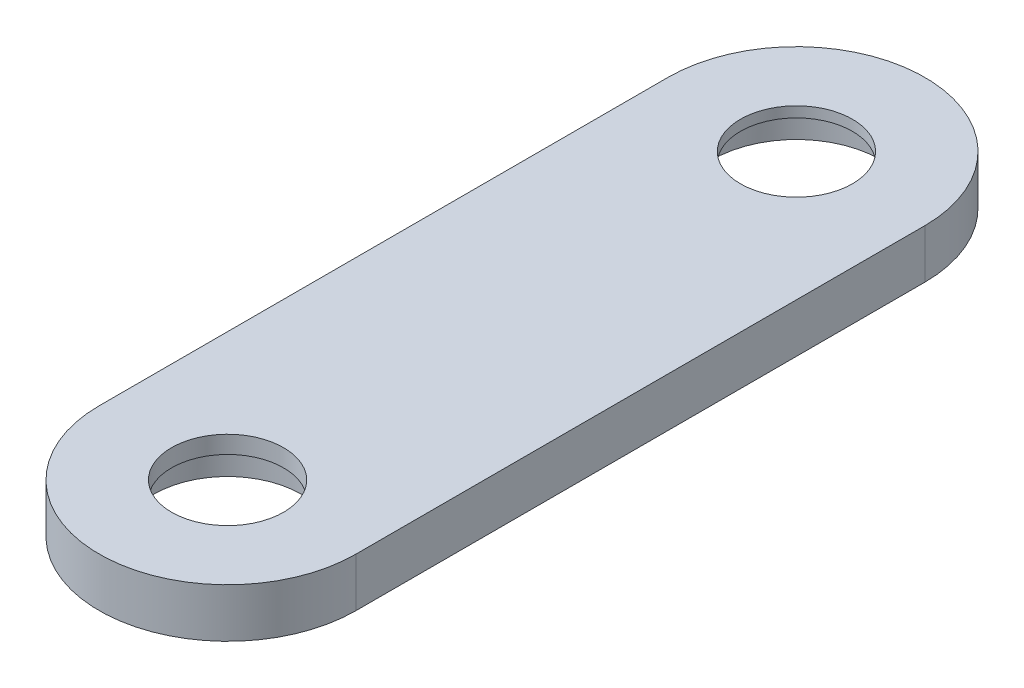
ISO-10303-21;
HEADER;
FILE_DESCRIPTION(('STEP AP214'),'2;1');
FILE_NAME('part.step','',(''),(''),'','','');
FILE_SCHEMA(('AUTOMOTIVE_DESIGN { 1 0 10303 214 1 1 1 1 }'));
ENDSEC;
DATA;
#1=APPLICATION_CONTEXT('core data for automotive mechanical design processes');
#2=APPLICATION_PROTOCOL_DEFINITION('international standard','automotive_design',2000,#1);
#3=PRODUCT_CONTEXT('',#1,'mechanical');
#4=PRODUCT('Part','Part','',(#3));
#5=PRODUCT_RELATED_PRODUCT_CATEGORY('part','',(#4));
#6=PRODUCT_DEFINITION_FORMATION('','',#4);
#7=PRODUCT_DEFINITION_CONTEXT('part definition',#1,'design');
#8=PRODUCT_DEFINITION('design','',#6,#7);
#9=PRODUCT_DEFINITION_SHAPE('','',#8);
#10=(LENGTH_UNIT() NAMED_UNIT(*) SI_UNIT(.MILLI.,.METRE.));
#11=(NAMED_UNIT(*) PLANE_ANGLE_UNIT() SI_UNIT($,.RADIAN.));
#12=(NAMED_UNIT(*) SI_UNIT($,.STERADIAN.) SOLID_ANGLE_UNIT());
#13=UNCERTAINTY_MEASURE_WITH_UNIT(LENGTH_MEASURE(1.E-05),#10,'distance_accuracy_value','');
#14=(GEOMETRIC_REPRESENTATION_CONTEXT(3) GLOBAL_UNCERTAINTY_ASSIGNED_CONTEXT((#13)) GLOBAL_UNIT_ASSIGNED_CONTEXT((#10,
#11,#12)) REPRESENTATION_CONTEXT('',''));
#15=CARTESIAN_POINT('',(0.,0.,0.));
#16=DIRECTION('',(0.,0.,1.));
#17=DIRECTION('',(1.,0.,0.));
#18=AXIS2_PLACEMENT_3D('',#15,#16,#17);
#19=CARTESIAN_POINT('',(0.,10.499999876,0.));
#20=DIRECTION('',(0.,1.,0.));
#21=DIRECTION('',(0.,0.,1.));
#22=AXIS2_PLACEMENT_3D('',#19,#20,#21);
#23=PLANE('',#22);
#24=CARTESIAN_POINT('',(0.,10.499999876,0.));
#25=DIRECTION('',(0.,1.,0.));
#26=DIRECTION('',(0.,0.,1.));
#27=AXIS2_PLACEMENT_3D('',#24,#25,#26);
#28=CIRCLE('',#27,8.);
#29=CARTESIAN_POINT('',(0.,10.499999876,8.));
#30=VERTEX_POINT('',#29);
#31=EDGE_CURVE('E98',#30,#30,#28,.T.);
#32=ORIENTED_EDGE('',*,*,#31,.T.);
#33=EDGE_LOOP('',(#32));
#34=FACE_BOUND('',#33,.T.);
#35=CARTESIAN_POINT('',(0.,10.499999876,0.));
#36=DIRECTION('',(0.,1.,0.));
#37=DIRECTION('',(0.,0.,1.));
#38=AXIS2_PLACEMENT_3D('',#35,#36,#37);
#39=CIRCLE('',#38,10.5);
#40=CARTESIAN_POINT('',(0.,10.499999876,10.5));
#41=VERTEX_POINT('',#40);
#42=EDGE_CURVE('E36',#41,#41,#39,.F.);
#43=ORIENTED_EDGE('',*,*,#42,.T.);
#44=EDGE_LOOP('',(#43));
#45=FACE_BOUND('',#44,.T.);
#46=ADVANCED_FACE('F33',(#34,#45),#23,.F.);
#47=CARTESIAN_POINT('',(0.,12.999999908,-81.28));
#48=DIRECTION('',(0.,-1.,0.));
#49=DIRECTION('',(0.,0.,-1.));
#50=AXIS2_PLACEMENT_3D('',#47,#48,#49);
#51=CYLINDRICAL_SURFACE('',#50,12.000000003);
#52=CARTESIAN_POINT('',(0.,6.,-81.28));
#53=DIRECTION('',(0.,-1.,0.));
#54=DIRECTION('',(0.,0.,-1.));
#55=AXIS2_PLACEMENT_3D('',#52,#53,#54);
#56=CIRCLE('',#55,12.000000003);
#57=CARTESIAN_POINT('',(0.,6.,-93.280000003));
#58=VERTEX_POINT('',#57);
#59=EDGE_CURVE('E121',#58,#58,#56,.F.);
#60=ORIENTED_EDGE('',*,*,#59,.F.);
#61=EDGE_LOOP('',(#60));
#62=FACE_BOUND('',#61,.T.);
#63=CARTESIAN_POINT('',(0.,11.499999908,-81.28));
#64=DIRECTION('',(0.,1.,0.));
#65=DIRECTION('',(0.,0.,1.));
#66=AXIS2_PLACEMENT_3D('',#63,#64,#65);
#67=CIRCLE('',#66,12.000000003);
#68=CARTESIAN_POINT('',(0.,11.499999908,-69.279999997));
#69=VERTEX_POINT('',#68);
#70=EDGE_CURVE('E116',#69,#69,#67,.T.);
#71=ORIENTED_EDGE('',*,*,#70,.T.);
#72=EDGE_LOOP('',(#71));
#73=FACE_BOUND('',#72,.T.);
#74=ADVANCED_FACE('F139',(#62,#73),#51,.F.);
#75=CARTESIAN_POINT('',(0.,12.999999908,0.));
#76=DIRECTION('',(0.,-1.,0.));
#77=DIRECTION('',(0.,0.,-1.));
#78=AXIS2_PLACEMENT_3D('',#75,#76,#77);
#79=CYLINDRICAL_SURFACE('',#78,18.350000003);
#80=CARTESIAN_POINT('',(0.,6.,0.));
#81=DIRECTION('',(0.,-1.,0.));
#82=DIRECTION('',(0.,0.,-1.));
#83=AXIS2_PLACEMENT_3D('',#80,#81,#82);
#84=CIRCLE('',#83,18.350000003);
#85=CARTESIAN_POINT('',(18.350000003,6.,0.));
#86=VERTEX_POINT('',#85);
#87=CARTESIAN_POINT('',(-18.350000003,6.,0.));
#88=VERTEX_POINT('',#87);
#89=EDGE_CURVE('E80',#86,#88,#84,.T.);
#90=ORIENTED_EDGE('',*,*,#89,.F.);
#91=DIRECTION('',(0.,-1.,0.));
#92=VECTOR('',#91,1.);
#93=CARTESIAN_POINT('',(18.350000003,12.999999908,0.));
#94=LINE('',#93,#92);
#95=CARTESIAN_POINT('',(18.350000003,12.999999908,0.));
#96=VERTEX_POINT('',#95);
#97=EDGE_CURVE('E12',#96,#86,#94,.T.);
#98=ORIENTED_EDGE('',*,*,#97,.F.);
#99=CARTESIAN_POINT('',(0.,12.999999908,0.));
#100=DIRECTION('',(0.,1.,0.));
#101=DIRECTION('',(0.,0.,1.));
#102=AXIS2_PLACEMENT_3D('',#99,#100,#101);
#103=CIRCLE('',#102,18.350000003);
#104=CARTESIAN_POINT('',(-18.350000003,12.999999908,0.));
#105=VERTEX_POINT('',#104);
#106=EDGE_CURVE('E124',#105,#96,#103,.T.);
#107=ORIENTED_EDGE('',*,*,#106,.F.);
#108=DIRECTION('',(0.,-1.,0.));
#109=VECTOR('',#108,1.);
#110=CARTESIAN_POINT('',(-18.350000003,12.999999908,0.));
#111=LINE('',#110,#109);
#112=EDGE_CURVE('E93',#105,#88,#111,.T.);
#113=ORIENTED_EDGE('',*,*,#112,.T.);
#114=EDGE_LOOP('',(#90,#98,#107,#113));
#115=FACE_BOUND('',#114,.T.);
#116=ADVANCED_FACE('F137',(#115),#79,.T.);
#117=CARTESIAN_POINT('',(18.350000003,12.999999908,0.));
#118=DIRECTION('',(-1.,0.,0.));
#119=DIRECTION('',(0.,0.,1.));
#120=AXIS2_PLACEMENT_3D('',#117,#118,#119);
#121=PLANE('',#120);
#122=ORIENTED_EDGE('',*,*,#97,.T.);
#123=DIRECTION('',(0.,0.,1.));
#124=VECTOR('',#123,1.);
#125=CARTESIAN_POINT('',(18.350000003,6.,0.));
#126=LINE('',#125,#124);
#127=CARTESIAN_POINT('',(18.350000003,6.,-81.28));
#128=VERTEX_POINT('',#127);
#129=EDGE_CURVE('E90',#128,#86,#126,.T.);
#130=ORIENTED_EDGE('',*,*,#129,.F.);
#131=DIRECTION('',(0.,-1.,0.));
#132=VECTOR('',#131,1.);
#133=CARTESIAN_POINT('',(18.350000003,12.999999908,-81.28));
#134=LINE('',#133,#132);
#135=CARTESIAN_POINT('',(18.350000003,12.999999908,-81.28));
#136=VERTEX_POINT('',#135);
#137=EDGE_CURVE('E41',#136,#128,#134,.T.);
#138=ORIENTED_EDGE('',*,*,#137,.F.);
#139=DIRECTION('',(0.,0.,-1.));
#140=VECTOR('',#139,1.);
#141=CARTESIAN_POINT('',(18.350000003,12.999999908,0.));
#142=LINE('',#141,#140);
#143=EDGE_CURVE('E127',#96,#136,#142,.T.);
#144=ORIENTED_EDGE('',*,*,#143,.F.);
#145=EDGE_LOOP('',(#122,#130,#138,#144));
#146=FACE_BOUND('',#145,.T.);
#147=ADVANCED_FACE('F135',(#146),#121,.F.);
#148=CARTESIAN_POINT('',(0.,12.999999908,-81.28));
#149=DIRECTION('',(0.,-1.,0.));
#150=DIRECTION('',(0.,0.,-1.));
#151=AXIS2_PLACEMENT_3D('',#148,#149,#150);
#152=CYLINDRICAL_SURFACE('',#151,18.350000003);
#153=CARTESIAN_POINT('',(0.,6.,-81.28));
#154=DIRECTION('',(0.,-1.,0.));
#155=DIRECTION('',(0.,0.,-1.));
#156=AXIS2_PLACEMENT_3D('',#153,#154,#155);
#157=CIRCLE('',#156,18.350000003);
#158=CARTESIAN_POINT('',(-18.350000003,6.,-81.28));
#159=VERTEX_POINT('',#158);
#160=EDGE_CURVE('E77',#159,#128,#157,.T.);
#161=ORIENTED_EDGE('',*,*,#160,.F.);
#162=DIRECTION('',(0.,-1.,0.));
#163=VECTOR('',#162,1.);
#164=CARTESIAN_POINT('',(-18.350000003,12.999999908,-81.28));
#165=LINE('',#164,#163);
#166=CARTESIAN_POINT('',(-18.350000003,12.999999908,-81.28));
#167=VERTEX_POINT('',#166);
#168=EDGE_CURVE('E88',#167,#159,#165,.T.);
#169=ORIENTED_EDGE('',*,*,#168,.F.);
#170=CARTESIAN_POINT('',(0.,12.999999908,-81.28));
#171=DIRECTION('',(0.,1.,0.));
#172=DIRECTION('',(0.,0.,1.));
#173=AXIS2_PLACEMENT_3D('',#170,#171,#172);
#174=CIRCLE('',#173,18.350000003);
#175=EDGE_CURVE('E129',#136,#167,#174,.T.);
#176=ORIENTED_EDGE('',*,*,#175,.F.);
#177=ORIENTED_EDGE('',*,*,#137,.T.);
#178=EDGE_LOOP('',(#161,#169,#176,#177));
#179=FACE_BOUND('',#178,.T.);
#180=ADVANCED_FACE('F86',(#179),#152,.T.);
#181=CARTESIAN_POINT('',(-18.350000003,12.999999908,0.));
#182=DIRECTION('',(1.,0.,0.));
#183=DIRECTION('',(0.,0.,-1.));
#184=AXIS2_PLACEMENT_3D('',#181,#182,#183);
#185=PLANE('',#184);
#186=DIRECTION('',(0.,0.,-1.));
#187=VECTOR('',#186,1.);
#188=CARTESIAN_POINT('',(-18.350000003,6.,0.));
#189=LINE('',#188,#187);
#190=EDGE_CURVE('E49',#88,#159,#189,.T.);
#191=ORIENTED_EDGE('',*,*,#190,.F.);
#192=ORIENTED_EDGE('',*,*,#112,.F.);
#193=DIRECTION('',(0.,0.,1.));
#194=VECTOR('',#193,1.);
#195=CARTESIAN_POINT('',(-18.350000003,12.999999908,0.));
#196=LINE('',#195,#194);
#197=EDGE_CURVE('E57',#167,#105,#196,.T.);
#198=ORIENTED_EDGE('',*,*,#197,.F.);
#199=ORIENTED_EDGE('',*,*,#168,.T.);
#200=EDGE_LOOP('',(#191,#192,#198,#199));
#201=FACE_BOUND('',#200,.T.);
#202=ADVANCED_FACE('F92',(#201),#185,.F.);
#203=CARTESIAN_POINT('',(0.,12.999999908,0.));
#204=DIRECTION('',(0.,1.,0.));
#205=DIRECTION('',(0.,0.,1.));
#206=AXIS2_PLACEMENT_3D('',#203,#204,#205);
#207=PLANE('',#206);
#208=ORIENTED_EDGE('',*,*,#106,.T.);
#209=ORIENTED_EDGE('',*,*,#143,.T.);
#210=ORIENTED_EDGE('',*,*,#175,.T.);
#211=ORIENTED_EDGE('',*,*,#197,.T.);
#212=EDGE_LOOP('',(#208,#209,#210,#211));
#213=FACE_BOUND('',#212,.T.);
#214=CARTESIAN_POINT('',(0.,12.999999908,-81.28));
#215=DIRECTION('',(0.,1.,0.));
#216=DIRECTION('',(0.,0.,1.));
#217=AXIS2_PLACEMENT_3D('',#214,#215,#216);
#218=CIRCLE('',#217,8.);
#219=CARTESIAN_POINT('',(0.,12.999999908,-73.28));
#220=VERTEX_POINT('',#219);
#221=EDGE_CURVE('E100',#220,#220,#218,.T.);
#222=ORIENTED_EDGE('',*,*,#221,.F.);
#223=EDGE_LOOP('',(#222));
#224=FACE_BOUND('',#223,.T.);
#225=CARTESIAN_POINT('',(0.,12.999999908,0.));
#226=DIRECTION('',(0.,1.,0.));
#227=DIRECTION('',(0.,0.,1.));
#228=AXIS2_PLACEMENT_3D('',#225,#226,#227);
#229=CIRCLE('',#228,8.);
#230=CARTESIAN_POINT('',(0.,12.999999908,8.));
#231=VERTEX_POINT('',#230);
#232=EDGE_CURVE('E101',#231,#231,#229,.T.);
#233=ORIENTED_EDGE('',*,*,#232,.F.);
#234=EDGE_LOOP('',(#233));
#235=FACE_BOUND('',#234,.T.);
#236=ADVANCED_FACE('F130',(#213,#224,#235),#207,.T.);
#237=CARTESIAN_POINT('',(0.,6.,0.));
#238=DIRECTION('',(0.,-1.,0.));
#239=DIRECTION('',(0.,0.,-1.));
#240=AXIS2_PLACEMENT_3D('',#237,#238,#239);
#241=PLANE('',#240);
#242=ORIENTED_EDGE('',*,*,#129,.T.);
#243=ORIENTED_EDGE('',*,*,#89,.T.);
#244=ORIENTED_EDGE('',*,*,#190,.T.);
#245=ORIENTED_EDGE('',*,*,#160,.T.);
#246=EDGE_LOOP('',(#242,#243,#244,#245));
#247=FACE_BOUND('',#246,.T.);
#248=ORIENTED_EDGE('',*,*,#59,.T.);
#249=EDGE_LOOP('',(#248));
#250=FACE_BOUND('',#249,.T.);
#251=CARTESIAN_POINT('',(0.,6.,0.));
#252=DIRECTION('',(0.,-1.,0.));
#253=DIRECTION('',(0.,0.,-1.));
#254=AXIS2_PLACEMENT_3D('',#251,#252,#253);
#255=CIRCLE('',#254,10.5);
#256=CARTESIAN_POINT('',(0.,6.,-10.5));
#257=VERTEX_POINT('',#256);
#258=EDGE_CURVE('E112',#257,#257,#255,.T.);
#259=ORIENTED_EDGE('',*,*,#258,.F.);
#260=EDGE_LOOP('',(#259));
#261=FACE_BOUND('',#260,.T.);
#262=ADVANCED_FACE('F75',(#247,#250,#261),#241,.T.);
#263=CARTESIAN_POINT('',(0.,11.499999908,-81.28));
#264=DIRECTION('',(0.,1.,0.));
#265=DIRECTION('',(0.,0.,1.));
#266=AXIS2_PLACEMENT_3D('',#263,#264,#265);
#267=PLANE('',#266);
#268=CARTESIAN_POINT('',(0.,11.499999908,-81.28));
#269=DIRECTION('',(0.,1.,0.));
#270=DIRECTION('',(0.,0.,1.));
#271=AXIS2_PLACEMENT_3D('',#268,#269,#270);
#272=CIRCLE('',#271,8.);
#273=CARTESIAN_POINT('',(0.,11.499999908,-73.28));
#274=VERTEX_POINT('',#273);
#275=EDGE_CURVE('E105',#274,#274,#272,.T.);
#276=ORIENTED_EDGE('',*,*,#275,.T.);
#277=EDGE_LOOP('',(#276));
#278=FACE_BOUND('',#277,.T.);
#279=ORIENTED_EDGE('',*,*,#70,.F.);
#280=EDGE_LOOP('',(#279));
#281=FACE_BOUND('',#280,.T.);
#282=ADVANCED_FACE('F162',(#278,#281),#267,.F.);
#283=CARTESIAN_POINT('',(0.,11.499999908,-81.28));
#284=DIRECTION('',(0.,1.,0.));
#285=DIRECTION('',(0.,0.,1.));
#286=AXIS2_PLACEMENT_3D('',#283,#284,#285);
#287=CYLINDRICAL_SURFACE('',#286,8.);
#288=ORIENTED_EDGE('',*,*,#275,.F.);
#289=EDGE_LOOP('',(#288));
#290=FACE_BOUND('',#289,.T.);
#291=ORIENTED_EDGE('',*,*,#221,.T.);
#292=EDGE_LOOP('',(#291));
#293=FACE_BOUND('',#292,.T.);
#294=ADVANCED_FACE('F168',(#290,#293),#287,.F.);
#295=CARTESIAN_POINT('',(0.,11.499999908,0.));
#296=DIRECTION('',(0.,1.,0.));
#297=DIRECTION('',(0.,0.,1.));
#298=AXIS2_PLACEMENT_3D('',#295,#296,#297);
#299=CYLINDRICAL_SURFACE('',#298,8.);
#300=ORIENTED_EDGE('',*,*,#31,.F.);
#301=EDGE_LOOP('',(#300));
#302=FACE_BOUND('',#301,.T.);
#303=ORIENTED_EDGE('',*,*,#232,.T.);
#304=EDGE_LOOP('',(#303));
#305=FACE_BOUND('',#304,.T.);
#306=ADVANCED_FACE('F156',(#302,#305),#299,.F.);
#307=CARTESIAN_POINT('',(0.,-27.9411255054396,0.));
#308=DIRECTION('',(0.,1.,0.));
#309=DIRECTION('',(0.,0.,1.));
#310=AXIS2_PLACEMENT_3D('',#307,#308,#309);
#311=CYLINDRICAL_SURFACE('',#310,10.5);
#312=ORIENTED_EDGE('',*,*,#42,.F.);
#313=EDGE_LOOP('',(#312));
#314=FACE_BOUND('',#313,.T.);
#315=ORIENTED_EDGE('',*,*,#258,.T.);
#316=EDGE_LOOP('',(#315));
#317=FACE_BOUND('',#316,.T.);
#318=ADVANCED_FACE('F153',(#314,#317),#311,.F.);
#319=CLOSED_SHELL('',(#46,#74,#116,#147,#180,#202,#236,#262,#282,#294,#306,#318));
#320=MANIFOLD_SOLID_BREP('B2',#319);
#321=ADVANCED_BREP_SHAPE_REPRESENTATION('',(#18,#320),#14);
#322=SHAPE_DEFINITION_REPRESENTATION(#9,#321);
ENDSEC;
END-ISO-10303-21;
